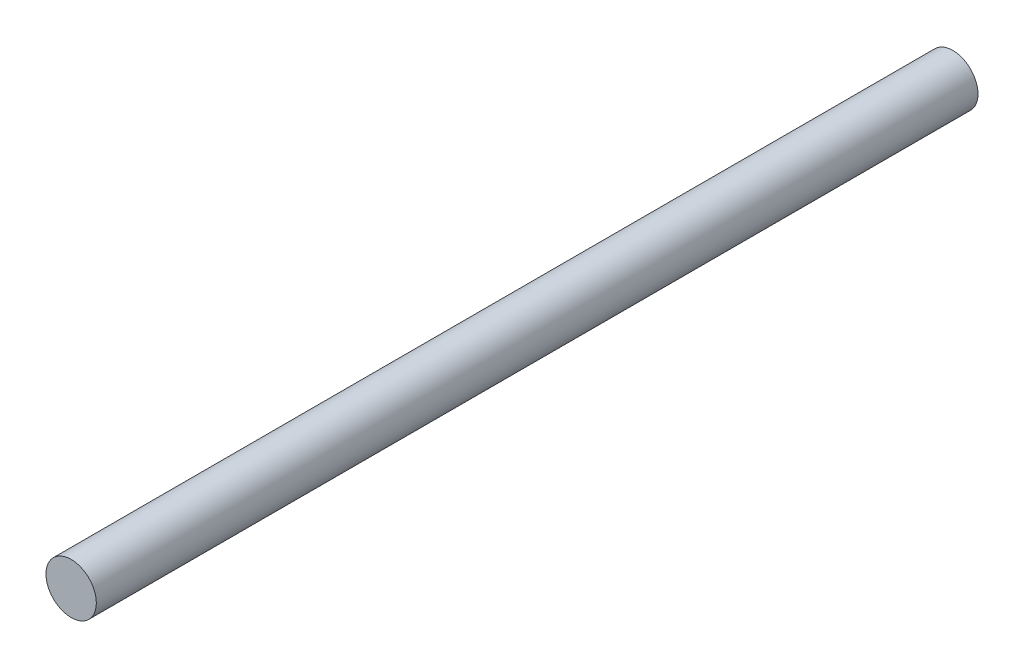
ISO-10303-21;
HEADER;
FILE_DESCRIPTION(('STEP AP214'),'2;1');
FILE_NAME('part.step','',(''),(''),'','','');
FILE_SCHEMA(('AUTOMOTIVE_DESIGN { 1 0 10303 214 1 1 1 1 }'));
ENDSEC;
DATA;
#1=APPLICATION_CONTEXT('core data for automotive mechanical design processes');
#2=APPLICATION_PROTOCOL_DEFINITION('international standard','automotive_design',2000,#1);
#3=PRODUCT_CONTEXT('',#1,'mechanical');
#4=PRODUCT('Part','Part','',(#3));
#5=PRODUCT_RELATED_PRODUCT_CATEGORY('part','',(#4));
#6=PRODUCT_DEFINITION_FORMATION('','',#4);
#7=PRODUCT_DEFINITION_CONTEXT('part definition',#1,'design');
#8=PRODUCT_DEFINITION('design','',#6,#7);
#9=PRODUCT_DEFINITION_SHAPE('','',#8);
#10=(LENGTH_UNIT() NAMED_UNIT(*) SI_UNIT(.MILLI.,.METRE.));
#11=(NAMED_UNIT(*) PLANE_ANGLE_UNIT() SI_UNIT($,.RADIAN.));
#12=(NAMED_UNIT(*) SI_UNIT($,.STERADIAN.) SOLID_ANGLE_UNIT());
#13=UNCERTAINTY_MEASURE_WITH_UNIT(LENGTH_MEASURE(1.E-05),#10,'distance_accuracy_value','');
#14=(GEOMETRIC_REPRESENTATION_CONTEXT(3) GLOBAL_UNCERTAINTY_ASSIGNED_CONTEXT((#13)) GLOBAL_UNIT_ASSIGNED_CONTEXT((#10,
#11,#12)) REPRESENTATION_CONTEXT('',''));
#15=CARTESIAN_POINT('',(0.,0.,0.));
#16=DIRECTION('',(0.,0.,1.));
#17=DIRECTION('',(1.,0.,0.));
#18=AXIS2_PLACEMENT_3D('',#15,#16,#17);
#19=CARTESIAN_POINT('',(0.,0.,105.));
#20=DIRECTION('',(0.,0.,-1.));
#21=DIRECTION('',(-1.,0.,0.));
#22=AXIS2_PLACEMENT_3D('',#19,#20,#21);
#23=CYLINDRICAL_SURFACE('',#22,3.);
#24=CARTESIAN_POINT('',(0.,0.,105.));
#25=DIRECTION('',(0.,0.,1.));
#26=DIRECTION('',(1.,0.,0.));
#27=AXIS2_PLACEMENT_3D('',#24,#25,#26);
#28=CIRCLE('',#27,3.);
#29=CARTESIAN_POINT('',(3.,0.,105.));
#30=VERTEX_POINT('',#29);
#31=EDGE_CURVE('E10',#30,#30,#28,.T.);
#32=ORIENTED_EDGE('',*,*,#31,.F.);
#33=EDGE_LOOP('',(#32));
#34=FACE_BOUND('',#33,.T.);
#35=CARTESIAN_POINT('',(0.,0.,0.));
#36=DIRECTION('',(0.,0.,1.));
#37=DIRECTION('',(1.,0.,0.));
#38=AXIS2_PLACEMENT_3D('',#35,#36,#37);
#39=CIRCLE('',#38,3.);
#40=CARTESIAN_POINT('',(3.,0.,0.));
#41=VERTEX_POINT('',#40);
#42=EDGE_CURVE('E44',#41,#41,#39,.T.);
#43=ORIENTED_EDGE('',*,*,#42,.T.);
#44=EDGE_LOOP('',(#43));
#45=FACE_BOUND('',#44,.T.);
#46=ADVANCED_FACE('F41',(#34,#45),#23,.T.);
#47=CARTESIAN_POINT('',(0.,0.,105.));
#48=DIRECTION('',(0.,0.,1.));
#49=DIRECTION('',(1.,0.,0.));
#50=AXIS2_PLACEMENT_3D('',#47,#48,#49);
#51=PLANE('',#50);
#52=ORIENTED_EDGE('',*,*,#31,.T.);
#53=EDGE_LOOP('',(#52));
#54=FACE_BOUND('',#53,.T.);
#55=ADVANCED_FACE('F58',(#54),#51,.T.);
#56=CARTESIAN_POINT('',(0.,0.,0.));
#57=DIRECTION('',(0.,0.,1.));
#58=DIRECTION('',(1.,0.,0.));
#59=AXIS2_PLACEMENT_3D('',#56,#57,#58);
#60=PLANE('',#59);
#61=ORIENTED_EDGE('',*,*,#42,.F.);
#62=EDGE_LOOP('',(#61));
#63=FACE_BOUND('',#62,.T.);
#64=ADVANCED_FACE('F56',(#63),#60,.F.);
#65=CLOSED_SHELL('',(#46,#55,#64));
#66=MANIFOLD_SOLID_BREP('B2',#65);
#67=ADVANCED_BREP_SHAPE_REPRESENTATION('',(#18,#66),#14);
#68=SHAPE_DEFINITION_REPRESENTATION(#9,#67);
ENDSEC;
END-ISO-10303-21;
